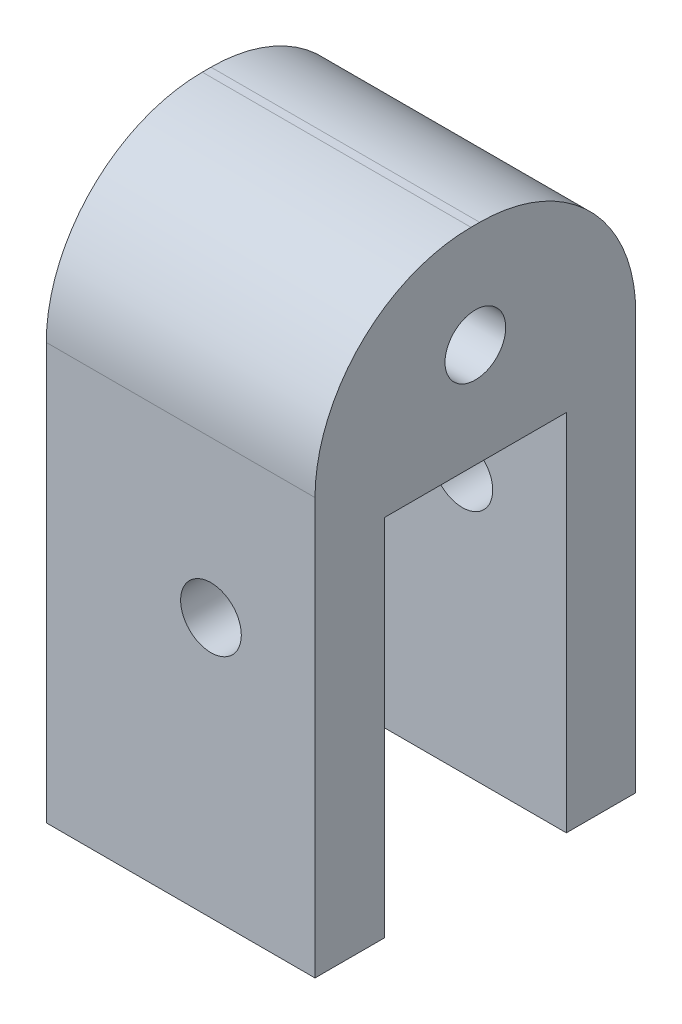
ISO-10303-21;
HEADER;
FILE_DESCRIPTION(('STEP AP214'),'2;1');
FILE_NAME('part.step','',(''),(''),'','','');
FILE_SCHEMA(('AUTOMOTIVE_DESIGN { 1 0 10303 214 1 1 1 1 }'));
ENDSEC;
DATA;
#1=APPLICATION_CONTEXT('core data for automotive mechanical design processes');
#2=APPLICATION_PROTOCOL_DEFINITION('international standard','automotive_design',2000,#1);
#3=PRODUCT_CONTEXT('',#1,'mechanical');
#4=PRODUCT('Part','Part','',(#3));
#5=PRODUCT_RELATED_PRODUCT_CATEGORY('part','',(#4));
#6=PRODUCT_DEFINITION_FORMATION('','',#4);
#7=PRODUCT_DEFINITION_CONTEXT('part definition',#1,'design');
#8=PRODUCT_DEFINITION('design','',#6,#7);
#9=PRODUCT_DEFINITION_SHAPE('','',#8);
#10=(LENGTH_UNIT() NAMED_UNIT(*) SI_UNIT(.MILLI.,.METRE.));
#11=(NAMED_UNIT(*) PLANE_ANGLE_UNIT() SI_UNIT($,.RADIAN.));
#12=(NAMED_UNIT(*) SI_UNIT($,.STERADIAN.) SOLID_ANGLE_UNIT());
#13=UNCERTAINTY_MEASURE_WITH_UNIT(LENGTH_MEASURE(1.E-05),#10,'distance_accuracy_value','');
#14=(GEOMETRIC_REPRESENTATION_CONTEXT(3) GLOBAL_UNCERTAINTY_ASSIGNED_CONTEXT((#13)) GLOBAL_UNIT_ASSIGNED_CONTEXT((#10,
#11,#12)) REPRESENTATION_CONTEXT('',''));
#15=CARTESIAN_POINT('',(0.,0.,0.));
#16=DIRECTION('',(0.,0.,1.));
#17=DIRECTION('',(1.,0.,0.));
#18=AXIS2_PLACEMENT_3D('',#15,#16,#17);
#19=CARTESIAN_POINT('',(15.5,21.,-18.5));
#20=DIRECTION('',(0.,0.,1.));
#21=DIRECTION('',(1.,0.,0.));
#22=AXIS2_PLACEMENT_3D('',#19,#20,#21);
#23=PLANE('',#22);
#24=CARTESIAN_POINT('',(9.5,15.,-18.5));
#25=DIRECTION('',(0.,0.,1.));
#26=DIRECTION('',(1.,0.,0.));
#27=AXIS2_PLACEMENT_3D('',#24,#25,#26);
#28=CIRCLE('',#27,1.75);
#29=CARTESIAN_POINT('',(11.25,15.,-18.5));
#30=VERTEX_POINT('',#29);
#31=EDGE_CURVE('E191',#30,#30,#28,.T.);
#32=ORIENTED_EDGE('',*,*,#31,.T.);
#33=EDGE_LOOP('',(#32));
#34=FACE_BOUND('',#33,.T.);
#35=DIRECTION('',(0.,-1.,0.));
#36=VECTOR('',#35,1.);
#37=CARTESIAN_POINT('',(0.,21.,-18.5));
#38=LINE('',#37,#36);
#39=CARTESIAN_POINT('',(0.,24.,-18.5));
#40=VERTEX_POINT('',#39);
#41=CARTESIAN_POINT('',(0.,0.,-18.5));
#42=VERTEX_POINT('',#41);
#43=EDGE_CURVE('E186',#40,#42,#38,.T.);
#44=ORIENTED_EDGE('',*,*,#43,.F.);
#45=DIRECTION('',(-1.,0.,0.));
#46=VECTOR('',#45,1.);
#47=CARTESIAN_POINT('',(15.5,24.,-18.5));
#48=LINE('',#47,#46);
#49=CARTESIAN_POINT('',(15.5,24.,-18.5));
#50=VERTEX_POINT('',#49);
#51=EDGE_CURVE('E63',#40,#50,#48,.F.);
#52=ORIENTED_EDGE('',*,*,#51,.T.);
#53=DIRECTION('',(0.,-1.,0.));
#54=VECTOR('',#53,1.);
#55=CARTESIAN_POINT('',(15.5,21.,-18.5));
#56=LINE('',#55,#54);
#57=CARTESIAN_POINT('',(15.5,0.,-18.5));
#58=VERTEX_POINT('',#57);
#59=EDGE_CURVE('E131',#50,#58,#56,.T.);
#60=ORIENTED_EDGE('',*,*,#59,.T.);
#61=DIRECTION('',(-1.,0.,0.));
#62=VECTOR('',#61,1.);
#63=CARTESIAN_POINT('',(15.5,0.,-18.5));
#64=LINE('',#63,#62);
#65=EDGE_CURVE('E159',#58,#42,#64,.T.);
#66=ORIENTED_EDGE('',*,*,#65,.T.);
#67=EDGE_LOOP('',(#44,#52,#60,#66));
#68=FACE_BOUND('',#67,.T.);
#69=ADVANCED_FACE('F40',(#34,#68),#23,.F.);
#70=CARTESIAN_POINT('',(0.,21.,-18.5));
#71=DIRECTION('',(1.,0.,0.));
#72=DIRECTION('',(0.,0.,-1.));
#73=AXIS2_PLACEMENT_3D('',#70,#71,#72);
#74=PLANE('',#73);
#75=CARTESIAN_POINT('',(0.,5.,-9.25));
#76=DIRECTION('',(1.,0.,0.));
#77=DIRECTION('',(0.,0.,-1.));
#78=AXIS2_PLACEMENT_3D('',#75,#76,#77);
#79=CIRCLE('',#78,1.75);
#80=CARTESIAN_POINT('',(0.,5.,-11.));
#81=VERTEX_POINT('',#80);
#82=EDGE_CURVE('E278',#81,#81,#79,.T.);
#83=ORIENTED_EDGE('',*,*,#82,.T.);
#84=EDGE_LOOP('',(#83));
#85=FACE_BOUND('',#84,.T.);
#86=CARTESIAN_POINT('',(0.,27.,-9.25));
#87=DIRECTION('',(-1.,0.,0.));
#88=DIRECTION('',(0.,0.,1.));
#89=AXIS2_PLACEMENT_3D('',#86,#87,#88);
#90=CIRCLE('',#89,1.75);
#91=CARTESIAN_POINT('',(0.,27.,-7.5));
#92=VERTEX_POINT('',#91);
#93=EDGE_CURVE('E283',#92,#92,#90,.T.);
#94=ORIENTED_EDGE('',*,*,#93,.F.);
#95=EDGE_LOOP('',(#94));
#96=FACE_BOUND('',#95,.T.);
#97=DIRECTION('',(0.,0.,1.));
#98=VECTOR('',#97,1.);
#99=CARTESIAN_POINT('',(0.,33.,-18.5));
#100=LINE('',#99,#98);
#101=CARTESIAN_POINT('',(0.,33.,-9.50000000000001));
#102=VERTEX_POINT('',#101);
#103=CARTESIAN_POINT('',(0.,33.,-9.));
#104=VERTEX_POINT('',#103);
#105=EDGE_CURVE('E148',#102,#104,#100,.T.);
#106=ORIENTED_EDGE('',*,*,#105,.F.);
#107=CARTESIAN_POINT('',(0.,24.,-9.50000000000001));
#108=DIRECTION('',(1.,0.,0.));
#109=DIRECTION('',(0.,0.,-1.));
#110=AXIS2_PLACEMENT_3D('',#107,#108,#109);
#111=CIRCLE('',#110,9.);
#112=EDGE_CURVE('E198',#102,#40,#111,.F.);
#113=ORIENTED_EDGE('',*,*,#112,.T.);
#114=ORIENTED_EDGE('',*,*,#43,.T.);
#115=DIRECTION('',(0.,0.,1.));
#116=VECTOR('',#115,1.);
#117=CARTESIAN_POINT('',(0.,0.,-18.5));
#118=LINE('',#117,#116);
#119=CARTESIAN_POINT('',(0.,0.,0.));
#120=VERTEX_POINT('',#119);
#121=EDGE_CURVE('E162',#42,#120,#118,.T.);
#122=ORIENTED_EDGE('',*,*,#121,.T.);
#123=DIRECTION('',(0.,-1.,0.));
#124=VECTOR('',#123,1.);
#125=CARTESIAN_POINT('',(0.,21.,0.));
#126=LINE('',#125,#124);
#127=CARTESIAN_POINT('',(0.,24.,0.));
#128=VERTEX_POINT('',#127);
#129=EDGE_CURVE('E184',#128,#120,#126,.T.);
#130=ORIENTED_EDGE('',*,*,#129,.F.);
#131=CARTESIAN_POINT('',(0.,24.,-9.));
#132=DIRECTION('',(1.,0.,0.));
#133=DIRECTION('',(0.,0.,-1.));
#134=AXIS2_PLACEMENT_3D('',#131,#132,#133);
#135=CIRCLE('',#134,9.);
#136=EDGE_CURVE('E196',#128,#104,#135,.F.);
#137=ORIENTED_EDGE('',*,*,#136,.T.);
#138=EDGE_LOOP('',(#106,#113,#114,#122,#130,#137));
#139=FACE_BOUND('',#138,.T.);
#140=ADVANCED_FACE('F212',(#85,#96,#139),#74,.F.);
#141=CARTESIAN_POINT('',(0.,21.,0.));
#142=DIRECTION('',(0.,0.,-1.));
#143=DIRECTION('',(-1.,0.,0.));
#144=AXIS2_PLACEMENT_3D('',#141,#142,#143);
#145=PLANE('',#144);
#146=CARTESIAN_POINT('',(9.5,15.,0.));
#147=DIRECTION('',(0.,0.,1.));
#148=DIRECTION('',(1.,0.,0.));
#149=AXIS2_PLACEMENT_3D('',#146,#147,#148);
#150=CIRCLE('',#149,1.75);
#151=CARTESIAN_POINT('',(11.25,15.,0.));
#152=VERTEX_POINT('',#151);
#153=EDGE_CURVE('E289',#152,#152,#150,.T.);
#154=ORIENTED_EDGE('',*,*,#153,.F.);
#155=EDGE_LOOP('',(#154));
#156=FACE_BOUND('',#155,.T.);
#157=DIRECTION('',(0.,-1.,0.));
#158=VECTOR('',#157,1.);
#159=CARTESIAN_POINT('',(15.5,21.,0.));
#160=LINE('',#159,#158);
#161=CARTESIAN_POINT('',(15.5,24.,0.));
#162=VERTEX_POINT('',#161);
#163=CARTESIAN_POINT('',(15.5,0.,0.));
#164=VERTEX_POINT('',#163);
#165=EDGE_CURVE('E182',#162,#164,#160,.T.);
#166=ORIENTED_EDGE('',*,*,#165,.F.);
#167=DIRECTION('',(-1.,0.,0.));
#168=VECTOR('',#167,1.);
#169=CARTESIAN_POINT('',(0.,24.,0.));
#170=LINE('',#169,#168);
#171=EDGE_CURVE('E11',#162,#128,#170,.T.);
#172=ORIENTED_EDGE('',*,*,#171,.T.);
#173=ORIENTED_EDGE('',*,*,#129,.T.);
#174=DIRECTION('',(1.,0.,0.));
#175=VECTOR('',#174,1.);
#176=CARTESIAN_POINT('',(0.,0.,0.));
#177=LINE('',#176,#175);
#178=EDGE_CURVE('E165',#120,#164,#177,.T.);
#179=ORIENTED_EDGE('',*,*,#178,.T.);
#180=EDGE_LOOP('',(#166,#172,#173,#179));
#181=FACE_BOUND('',#180,.T.);
#182=ADVANCED_FACE('F221',(#156,#181),#145,.F.);
#183=CARTESIAN_POINT('',(15.5,21.,-4.));
#184=DIRECTION('',(0.,0.,1.));
#185=DIRECTION('',(1.,0.,0.));
#186=AXIS2_PLACEMENT_3D('',#183,#184,#185);
#187=PLANE('',#186);
#188=CARTESIAN_POINT('',(9.5,15.,-3.99999999999999));
#189=DIRECTION('',(0.,0.,1.));
#190=DIRECTION('',(1.,0.,0.));
#191=AXIS2_PLACEMENT_3D('',#188,#189,#190);
#192=CIRCLE('',#191,1.75);
#193=CARTESIAN_POINT('',(11.25,15.,-3.99999999999999));
#194=VERTEX_POINT('',#193);
#195=EDGE_CURVE('E146',#194,#194,#192,.T.);
#196=ORIENTED_EDGE('',*,*,#195,.T.);
#197=EDGE_LOOP('',(#196));
#198=FACE_BOUND('',#197,.T.);
#199=DIRECTION('',(-1.,0.,0.));
#200=VECTOR('',#199,1.);
#201=CARTESIAN_POINT('',(15.5,0.,-4.));
#202=LINE('',#201,#200);
#203=CARTESIAN_POINT('',(15.5,0.,-4.));
#204=VERTEX_POINT('',#203);
#205=CARTESIAN_POINT('',(4.,0.,-3.99999999999999));
#206=VERTEX_POINT('',#205);
#207=EDGE_CURVE('E170',#204,#206,#202,.T.);
#208=ORIENTED_EDGE('',*,*,#207,.T.);
#209=DIRECTION('',(0.,-1.,0.));
#210=VECTOR('',#209,1.);
#211=CARTESIAN_POINT('',(4.,21.,-3.99999999999999));
#212=LINE('',#211,#210);
#213=CARTESIAN_POINT('',(4.,21.,-3.99999999999999));
#214=VERTEX_POINT('',#213);
#215=EDGE_CURVE('E178',#214,#206,#212,.T.);
#216=ORIENTED_EDGE('',*,*,#215,.F.);
#217=DIRECTION('',(-1.,0.,0.));
#218=VECTOR('',#217,1.);
#219=CARTESIAN_POINT('',(15.5,21.,-4.));
#220=LINE('',#219,#218);
#221=CARTESIAN_POINT('',(15.5,21.,-4.));
#222=VERTEX_POINT('',#221);
#223=EDGE_CURVE('E155',#222,#214,#220,.T.);
#224=ORIENTED_EDGE('',*,*,#223,.F.);
#225=DIRECTION('',(0.,-1.,0.));
#226=VECTOR('',#225,1.);
#227=CARTESIAN_POINT('',(15.5,21.,-4.));
#228=LINE('',#227,#226);
#229=EDGE_CURVE('E143',#222,#204,#228,.T.);
#230=ORIENTED_EDGE('',*,*,#229,.T.);
#231=EDGE_LOOP('',(#208,#216,#224,#230));
#232=FACE_BOUND('',#231,.T.);
#233=ADVANCED_FACE('F241',(#198,#232),#187,.F.);
#234=CARTESIAN_POINT('',(4.,21.,-3.99999999999999));
#235=DIRECTION('',(-1.,0.,0.));
#236=DIRECTION('',(0.,0.,1.));
#237=AXIS2_PLACEMENT_3D('',#234,#235,#236);
#238=PLANE('',#237);
#239=CARTESIAN_POINT('',(4.,5.,-9.25));
#240=DIRECTION('',(1.,0.,0.));
#241=DIRECTION('',(0.,0.,-1.));
#242=AXIS2_PLACEMENT_3D('',#239,#240,#241);
#243=CIRCLE('',#242,1.75);
#244=CARTESIAN_POINT('',(4.,5.,-11.));
#245=VERTEX_POINT('',#244);
#246=EDGE_CURVE('E281',#245,#245,#243,.T.);
#247=ORIENTED_EDGE('',*,*,#246,.F.);
#248=EDGE_LOOP('',(#247));
#249=FACE_BOUND('',#248,.T.);
#250=DIRECTION('',(0.,0.,-1.));
#251=VECTOR('',#250,1.);
#252=CARTESIAN_POINT('',(4.,0.,-3.99999999999999));
#253=LINE('',#252,#251);
#254=CARTESIAN_POINT('',(4.,0.,-14.5));
#255=VERTEX_POINT('',#254);
#256=EDGE_CURVE('E172',#206,#255,#253,.T.);
#257=ORIENTED_EDGE('',*,*,#256,.T.);
#258=DIRECTION('',(0.,-1.,0.));
#259=VECTOR('',#258,1.);
#260=CARTESIAN_POINT('',(4.,21.,-14.5));
#261=LINE('',#260,#259);
#262=CARTESIAN_POINT('',(4.,21.,-14.5));
#263=VERTEX_POINT('',#262);
#264=EDGE_CURVE('E130',#263,#255,#261,.T.);
#265=ORIENTED_EDGE('',*,*,#264,.F.);
#266=DIRECTION('',(0.,0.,-1.));
#267=VECTOR('',#266,1.);
#268=CARTESIAN_POINT('',(4.,21.,-3.99999999999999));
#269=LINE('',#268,#267);
#270=EDGE_CURVE('E139',#214,#263,#269,.T.);
#271=ORIENTED_EDGE('',*,*,#270,.F.);
#272=ORIENTED_EDGE('',*,*,#215,.T.);
#273=EDGE_LOOP('',(#257,#265,#271,#272));
#274=FACE_BOUND('',#273,.T.);
#275=ADVANCED_FACE('F245',(#249,#274),#238,.F.);
#276=CARTESIAN_POINT('',(4.,21.,-14.5));
#277=DIRECTION('',(0.,0.,-1.));
#278=DIRECTION('',(-1.,0.,0.));
#279=AXIS2_PLACEMENT_3D('',#276,#277,#278);
#280=PLANE('',#279);
#281=CARTESIAN_POINT('',(9.5,15.,-14.5));
#282=DIRECTION('',(0.,0.,-1.));
#283=DIRECTION('',(-1.,0.,0.));
#284=AXIS2_PLACEMENT_3D('',#281,#282,#283);
#285=CIRCLE('',#284,1.75);
#286=CARTESIAN_POINT('',(7.75,15.,-14.5));
#287=VERTEX_POINT('',#286);
#288=EDGE_CURVE('E151',#287,#287,#285,.T.);
#289=ORIENTED_EDGE('',*,*,#288,.T.);
#290=EDGE_LOOP('',(#289));
#291=FACE_BOUND('',#290,.T.);
#292=DIRECTION('',(1.,0.,0.));
#293=VECTOR('',#292,1.);
#294=CARTESIAN_POINT('',(4.,0.,-14.5));
#295=LINE('',#294,#293);
#296=CARTESIAN_POINT('',(15.5,0.,-14.5));
#297=VERTEX_POINT('',#296);
#298=EDGE_CURVE('E126',#255,#297,#295,.T.);
#299=ORIENTED_EDGE('',*,*,#298,.T.);
#300=DIRECTION('',(0.,-1.,0.));
#301=VECTOR('',#300,1.);
#302=CARTESIAN_POINT('',(15.5,21.,-14.5));
#303=LINE('',#302,#301);
#304=CARTESIAN_POINT('',(15.5,21.,-14.5));
#305=VERTEX_POINT('',#304);
#306=EDGE_CURVE('E119',#305,#297,#303,.T.);
#307=ORIENTED_EDGE('',*,*,#306,.F.);
#308=DIRECTION('',(1.,0.,0.));
#309=VECTOR('',#308,1.);
#310=CARTESIAN_POINT('',(4.,21.,-14.5));
#311=LINE('',#310,#309);
#312=EDGE_CURVE('E123',#263,#305,#311,.T.);
#313=ORIENTED_EDGE('',*,*,#312,.F.);
#314=ORIENTED_EDGE('',*,*,#264,.T.);
#315=EDGE_LOOP('',(#299,#307,#313,#314));
#316=FACE_BOUND('',#315,.T.);
#317=ADVANCED_FACE('F121',(#291,#316),#280,.F.);
#318=CARTESIAN_POINT('',(15.5,21.,-14.5));
#319=DIRECTION('',(-1.,0.,0.));
#320=DIRECTION('',(0.,0.,1.));
#321=AXIS2_PLACEMENT_3D('',#318,#319,#320);
#322=PLANE('',#321);
#323=CARTESIAN_POINT('',(15.5,27.,-9.25));
#324=DIRECTION('',(-1.,0.,0.));
#325=DIRECTION('',(0.,0.,1.));
#326=AXIS2_PLACEMENT_3D('',#323,#324,#325);
#327=CIRCLE('',#326,1.75);
#328=CARTESIAN_POINT('',(15.5,27.,-7.5));
#329=VERTEX_POINT('',#328);
#330=EDGE_CURVE('E286',#329,#329,#327,.T.);
#331=ORIENTED_EDGE('',*,*,#330,.T.);
#332=EDGE_LOOP('',(#331));
#333=FACE_BOUND('',#332,.T.);
#334=ORIENTED_EDGE('',*,*,#59,.F.);
#335=CARTESIAN_POINT('',(15.5,24.,-9.50000000000001));
#336=DIRECTION('',(-1.,0.,0.));
#337=DIRECTION('',(0.,0.,1.));
#338=AXIS2_PLACEMENT_3D('',#335,#336,#337);
#339=CIRCLE('',#338,9.);
#340=CARTESIAN_POINT('',(15.5,33.,-9.50000000000001));
#341=VERTEX_POINT('',#340);
#342=EDGE_CURVE('E48',#50,#341,#339,.F.);
#343=ORIENTED_EDGE('',*,*,#342,.T.);
#344=DIRECTION('',(0.,0.,1.));
#345=VECTOR('',#344,1.);
#346=CARTESIAN_POINT('',(15.5,33.,-18.5));
#347=LINE('',#346,#345);
#348=CARTESIAN_POINT('',(15.5,33.,-9.));
#349=VERTEX_POINT('',#348);
#350=EDGE_CURVE('E145',#341,#349,#347,.T.);
#351=ORIENTED_EDGE('',*,*,#350,.T.);
#352=CARTESIAN_POINT('',(15.5,24.,-9.));
#353=DIRECTION('',(-1.,0.,0.));
#354=DIRECTION('',(0.,0.,1.));
#355=AXIS2_PLACEMENT_3D('',#352,#353,#354);
#356=CIRCLE('',#355,9.);
#357=EDGE_CURVE('E55',#349,#162,#356,.F.);
#358=ORIENTED_EDGE('',*,*,#357,.T.);
#359=ORIENTED_EDGE('',*,*,#165,.T.);
#360=DIRECTION('',(0.,0.,-1.));
#361=VECTOR('',#360,1.);
#362=CARTESIAN_POINT('',(15.5,0.,0.));
#363=LINE('',#362,#361);
#364=EDGE_CURVE('E168',#164,#204,#363,.T.);
#365=ORIENTED_EDGE('',*,*,#364,.T.);
#366=ORIENTED_EDGE('',*,*,#229,.F.);
#367=DIRECTION('',(0.,0.,1.));
#368=VECTOR('',#367,1.);
#369=CARTESIAN_POINT('',(15.5,21.,-18.5));
#370=LINE('',#369,#368);
#371=EDGE_CURVE('E137',#305,#222,#370,.T.);
#372=ORIENTED_EDGE('',*,*,#371,.F.);
#373=ORIENTED_EDGE('',*,*,#306,.T.);
#374=DIRECTION('',(0.,0.,-1.));
#375=VECTOR('',#374,1.);
#376=CARTESIAN_POINT('',(15.5,0.,-14.5));
#377=LINE('',#376,#375);
#378=EDGE_CURVE('E157',#297,#58,#377,.T.);
#379=ORIENTED_EDGE('',*,*,#378,.T.);
#380=EDGE_LOOP('',(#334,#343,#351,#358,#359,#365,#366,#372,#373,#379));
#381=FACE_BOUND('',#380,.T.);
#382=ADVANCED_FACE('F141',(#333,#381),#322,.F.);
#383=CARTESIAN_POINT('',(0.,0.,0.));
#384=DIRECTION('',(0.,1.,0.));
#385=DIRECTION('',(0.,0.,1.));
#386=AXIS2_PLACEMENT_3D('',#383,#384,#385);
#387=PLANE('',#386);
#388=ORIENTED_EDGE('',*,*,#65,.F.);
#389=ORIENTED_EDGE('',*,*,#378,.F.);
#390=ORIENTED_EDGE('',*,*,#298,.F.);
#391=ORIENTED_EDGE('',*,*,#256,.F.);
#392=ORIENTED_EDGE('',*,*,#207,.F.);
#393=ORIENTED_EDGE('',*,*,#364,.F.);
#394=ORIENTED_EDGE('',*,*,#178,.F.);
#395=ORIENTED_EDGE('',*,*,#121,.F.);
#396=EDGE_LOOP('',(#388,#389,#390,#391,#392,#393,#394,#395));
#397=FACE_BOUND('',#396,.T.);
#398=ADVANCED_FACE('F216',(#397),#387,.F.);
#399=CARTESIAN_POINT('',(0.,21.,-18.5));
#400=DIRECTION('',(0.,-1.,0.));
#401=DIRECTION('',(0.,0.,-1.));
#402=AXIS2_PLACEMENT_3D('',#399,#400,#401);
#403=PLANE('',#402);
#404=ORIENTED_EDGE('',*,*,#371,.T.);
#405=ORIENTED_EDGE('',*,*,#223,.T.);
#406=ORIENTED_EDGE('',*,*,#270,.T.);
#407=ORIENTED_EDGE('',*,*,#312,.T.);
#408=EDGE_LOOP('',(#404,#405,#406,#407));
#409=FACE_BOUND('',#408,.T.);
#410=ADVANCED_FACE('F135',(#409),#403,.T.);
#411=CARTESIAN_POINT('',(15.5,33.,-18.5));
#412=DIRECTION('',(0.,1.,0.));
#413=DIRECTION('',(0.,0.,1.));
#414=AXIS2_PLACEMENT_3D('',#411,#412,#413);
#415=PLANE('',#414);
#416=ORIENTED_EDGE('',*,*,#350,.F.);
#417=DIRECTION('',(-1.,0.,0.));
#418=VECTOR('',#417,1.);
#419=CARTESIAN_POINT('',(0.,33.,-9.50000000000001));
#420=LINE('',#419,#418);
#421=EDGE_CURVE('E193',#341,#102,#420,.T.);
#422=ORIENTED_EDGE('',*,*,#421,.T.);
#423=ORIENTED_EDGE('',*,*,#105,.T.);
#424=DIRECTION('',(-1.,0.,0.));
#425=VECTOR('',#424,1.);
#426=CARTESIAN_POINT('',(15.5,33.,-9.));
#427=LINE('',#426,#425);
#428=EDGE_CURVE('E188',#104,#349,#427,.F.);
#429=ORIENTED_EDGE('',*,*,#428,.T.);
#430=EDGE_LOOP('',(#416,#422,#423,#429));
#431=FACE_BOUND('',#430,.T.);
#432=ADVANCED_FACE('F206',(#431),#415,.T.);
#433=CARTESIAN_POINT('',(9.5,15.,-18.5));
#434=DIRECTION('',(0.,0.,1.));
#435=DIRECTION('',(1.,0.,0.));
#436=AXIS2_PLACEMENT_3D('',#433,#434,#435);
#437=CYLINDRICAL_SURFACE('',#436,1.75);
#438=ORIENTED_EDGE('',*,*,#31,.F.);
#439=EDGE_LOOP('',(#438));
#440=FACE_BOUND('',#439,.T.);
#441=ORIENTED_EDGE('',*,*,#288,.F.);
#442=EDGE_LOOP('',(#441));
#443=FACE_BOUND('',#442,.T.);
#444=ADVANCED_FACE('F262',(#440,#443),#437,.F.);
#445=ORIENTED_EDGE('',*,*,#153,.T.);
#446=EDGE_LOOP('',(#445));
#447=FACE_BOUND('',#446,.T.);
#448=ORIENTED_EDGE('',*,*,#195,.F.);
#449=EDGE_LOOP('',(#448));
#450=FACE_BOUND('',#449,.T.);
#451=ADVANCED_FACE('F263',(#447,#450),#437,.F.);
#452=CARTESIAN_POINT('',(15.5,27.,-9.25));
#453=DIRECTION('',(-1.,0.,0.));
#454=DIRECTION('',(0.,0.,1.));
#455=AXIS2_PLACEMENT_3D('',#452,#453,#454);
#456=CYLINDRICAL_SURFACE('',#455,1.75);
#457=ORIENTED_EDGE('',*,*,#330,.F.);
#458=EDGE_LOOP('',(#457));
#459=FACE_BOUND('',#458,.T.);
#460=ORIENTED_EDGE('',*,*,#93,.T.);
#461=EDGE_LOOP('',(#460));
#462=FACE_BOUND('',#461,.T.);
#463=ADVANCED_FACE('F266',(#459,#462),#456,.F.);
#464=CARTESIAN_POINT('',(0.,5.,-9.25));
#465=DIRECTION('',(1.,0.,0.));
#466=DIRECTION('',(0.,0.,-1.));
#467=AXIS2_PLACEMENT_3D('',#464,#465,#466);
#468=CYLINDRICAL_SURFACE('',#467,1.75);
#469=ORIENTED_EDGE('',*,*,#82,.F.);
#470=EDGE_LOOP('',(#469));
#471=FACE_BOUND('',#470,.T.);
#472=ORIENTED_EDGE('',*,*,#246,.T.);
#473=EDGE_LOOP('',(#472));
#474=FACE_BOUND('',#473,.T.);
#475=ADVANCED_FACE('F228',(#471,#474),#468,.F.);
#476=CARTESIAN_POINT('',(15.5,24.,-9.50000000000001));
#477=DIRECTION('',(1.,0.,0.));
#478=DIRECTION('',(0.,0.,-1.));
#479=AXIS2_PLACEMENT_3D('',#476,#477,#478);
#480=CYLINDRICAL_SURFACE('',#479,9.);
#481=ORIENTED_EDGE('',*,*,#342,.F.);
#482=ORIENTED_EDGE('',*,*,#51,.F.);
#483=ORIENTED_EDGE('',*,*,#112,.F.);
#484=ORIENTED_EDGE('',*,*,#421,.F.);
#485=EDGE_LOOP('',(#481,#482,#483,#484));
#486=FACE_BOUND('',#485,.T.);
#487=ADVANCED_FACE('F210',(#486),#480,.T.);
#488=CARTESIAN_POINT('',(0.,24.,-9.));
#489=DIRECTION('',(1.,0.,0.));
#490=DIRECTION('',(0.,0.,-1.));
#491=AXIS2_PLACEMENT_3D('',#488,#489,#490);
#492=CYLINDRICAL_SURFACE('',#491,9.);
#493=ORIENTED_EDGE('',*,*,#357,.F.);
#494=ORIENTED_EDGE('',*,*,#428,.F.);
#495=ORIENTED_EDGE('',*,*,#136,.F.);
#496=ORIENTED_EDGE('',*,*,#171,.F.);
#497=EDGE_LOOP('',(#493,#494,#495,#496));
#498=FACE_BOUND('',#497,.T.);
#499=ADVANCED_FACE('F42',(#498),#492,.T.);
#500=CLOSED_SHELL('',(#69,#140,#182,#233,#275,#317,#382,#398,#410,#432,#444,#451,#463,#475,#487,#499));
#501=MANIFOLD_SOLID_BREP('B2',#500);
#502=ADVANCED_BREP_SHAPE_REPRESENTATION('',(#18,#501),#14);
#503=SHAPE_DEFINITION_REPRESENTATION(#9,#502);
ENDSEC;
END-ISO-10303-21;
